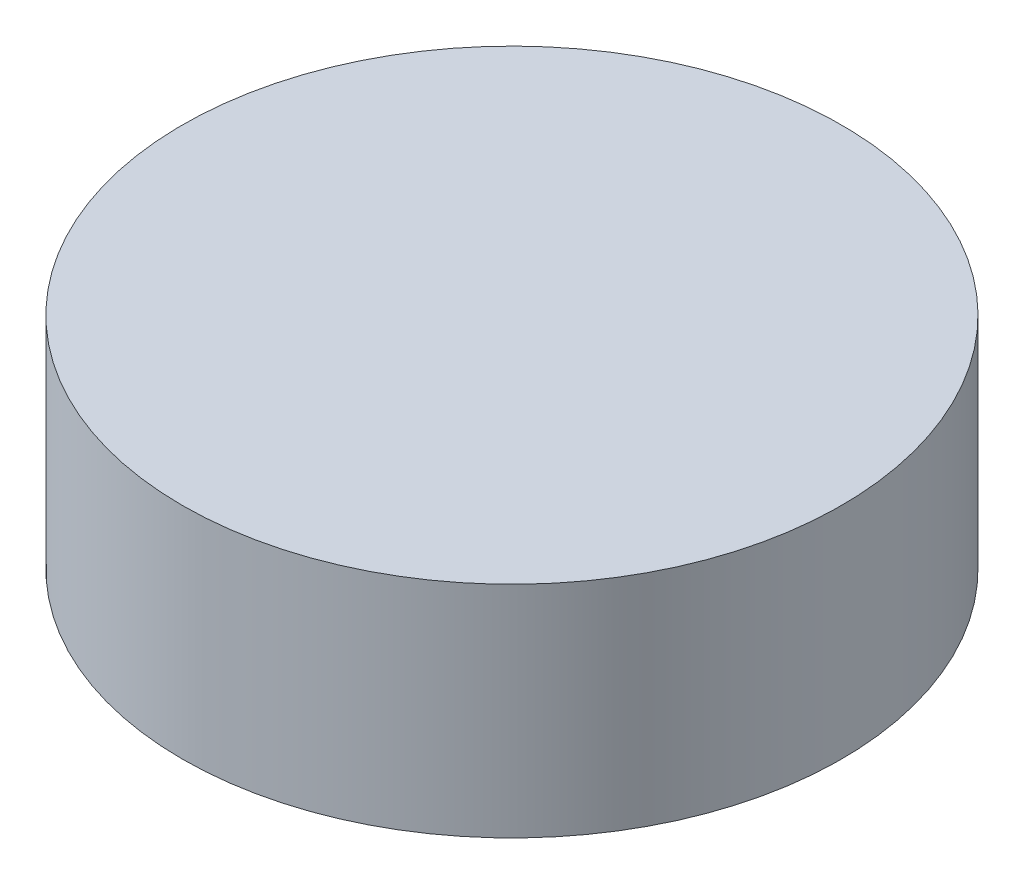
ISO-10303-21;
HEADER;
FILE_DESCRIPTION(('STEP AP214'),'2;1');
FILE_NAME('part.step','',(''),(''),'','','');
FILE_SCHEMA(('AUTOMOTIVE_DESIGN { 1 0 10303 214 1 1 1 1 }'));
ENDSEC;
DATA;
#1=APPLICATION_CONTEXT('core data for automotive mechanical design processes');
#2=APPLICATION_PROTOCOL_DEFINITION('international standard','automotive_design',2000,#1);
#3=PRODUCT_CONTEXT('',#1,'mechanical');
#4=PRODUCT('Part','Part','',(#3));
#5=PRODUCT_RELATED_PRODUCT_CATEGORY('part','',(#4));
#6=PRODUCT_DEFINITION_FORMATION('','',#4);
#7=PRODUCT_DEFINITION_CONTEXT('part definition',#1,'design');
#8=PRODUCT_DEFINITION('design','',#6,#7);
#9=PRODUCT_DEFINITION_SHAPE('','',#8);
#10=(LENGTH_UNIT() NAMED_UNIT(*) SI_UNIT(.MILLI.,.METRE.));
#11=(NAMED_UNIT(*) PLANE_ANGLE_UNIT() SI_UNIT($,.RADIAN.));
#12=(NAMED_UNIT(*) SI_UNIT($,.STERADIAN.) SOLID_ANGLE_UNIT());
#13=UNCERTAINTY_MEASURE_WITH_UNIT(LENGTH_MEASURE(1.E-05),#10,'distance_accuracy_value','');
#14=(GEOMETRIC_REPRESENTATION_CONTEXT(3) GLOBAL_UNCERTAINTY_ASSIGNED_CONTEXT((#13)) GLOBAL_UNIT_ASSIGNED_CONTEXT((#10,
#11,#12)) REPRESENTATION_CONTEXT('',''));
#15=CARTESIAN_POINT('',(0.,0.,0.));
#16=DIRECTION('',(0.,0.,1.));
#17=DIRECTION('',(1.,0.,0.));
#18=AXIS2_PLACEMENT_3D('',#15,#16,#17);
#19=CARTESIAN_POINT('',(0.,30.,0.));
#20=DIRECTION('',(0.,-1.,0.));
#21=DIRECTION('',(0.,0.,-1.));
#22=AXIS2_PLACEMENT_3D('',#19,#20,#21);
#23=CYLINDRICAL_SURFACE('',#22,45.);
#24=CARTESIAN_POINT('',(0.,30.,0.));
#25=DIRECTION('',(0.,1.,0.));
#26=DIRECTION('',(0.,0.,1.));
#27=AXIS2_PLACEMENT_3D('',#24,#25,#26);
#28=CIRCLE('',#27,45.);
#29=CARTESIAN_POINT('',(0.,30.,45.));
#30=VERTEX_POINT('',#29);
#31=EDGE_CURVE('E10',#30,#30,#28,.T.);
#32=ORIENTED_EDGE('',*,*,#31,.F.);
#33=EDGE_LOOP('',(#32));
#34=FACE_BOUND('',#33,.T.);
#35=CARTESIAN_POINT('',(0.,0.,0.));
#36=DIRECTION('',(0.,1.,0.));
#37=DIRECTION('',(0.,0.,1.));
#38=AXIS2_PLACEMENT_3D('',#35,#36,#37);
#39=CIRCLE('',#38,45.);
#40=CARTESIAN_POINT('',(0.,0.,45.));
#41=VERTEX_POINT('',#40);
#42=EDGE_CURVE('E46',#41,#41,#39,.T.);
#43=ORIENTED_EDGE('',*,*,#42,.T.);
#44=EDGE_LOOP('',(#43));
#45=FACE_BOUND('',#44,.T.);
#46=ADVANCED_FACE('F43',(#34,#45),#23,.T.);
#47=CARTESIAN_POINT('',(0.,30.,0.));
#48=DIRECTION('',(0.,1.,0.));
#49=DIRECTION('',(0.,0.,1.));
#50=AXIS2_PLACEMENT_3D('',#47,#48,#49);
#51=PLANE('',#50);
#52=ORIENTED_EDGE('',*,*,#31,.T.);
#53=EDGE_LOOP('',(#52));
#54=FACE_BOUND('',#53,.T.);
#55=ADVANCED_FACE('F58',(#54),#51,.T.);
#56=CARTESIAN_POINT('',(0.,0.,0.));
#57=DIRECTION('',(0.,1.,0.));
#58=DIRECTION('',(0.,0.,1.));
#59=AXIS2_PLACEMENT_3D('',#56,#57,#58);
#60=PLANE('',#59);
#61=ORIENTED_EDGE('',*,*,#42,.F.);
#62=EDGE_LOOP('',(#61));
#63=FACE_BOUND('',#62,.T.);
#64=ADVANCED_FACE('F56',(#63),#60,.F.);
#65=CLOSED_SHELL('',(#46,#55,#64));
#66=MANIFOLD_SOLID_BREP('B2',#65);
#67=ADVANCED_BREP_SHAPE_REPRESENTATION('',(#18,#66),#14);
#68=SHAPE_DEFINITION_REPRESENTATION(#9,#67);
ENDSEC;
END-ISO-10303-21;
